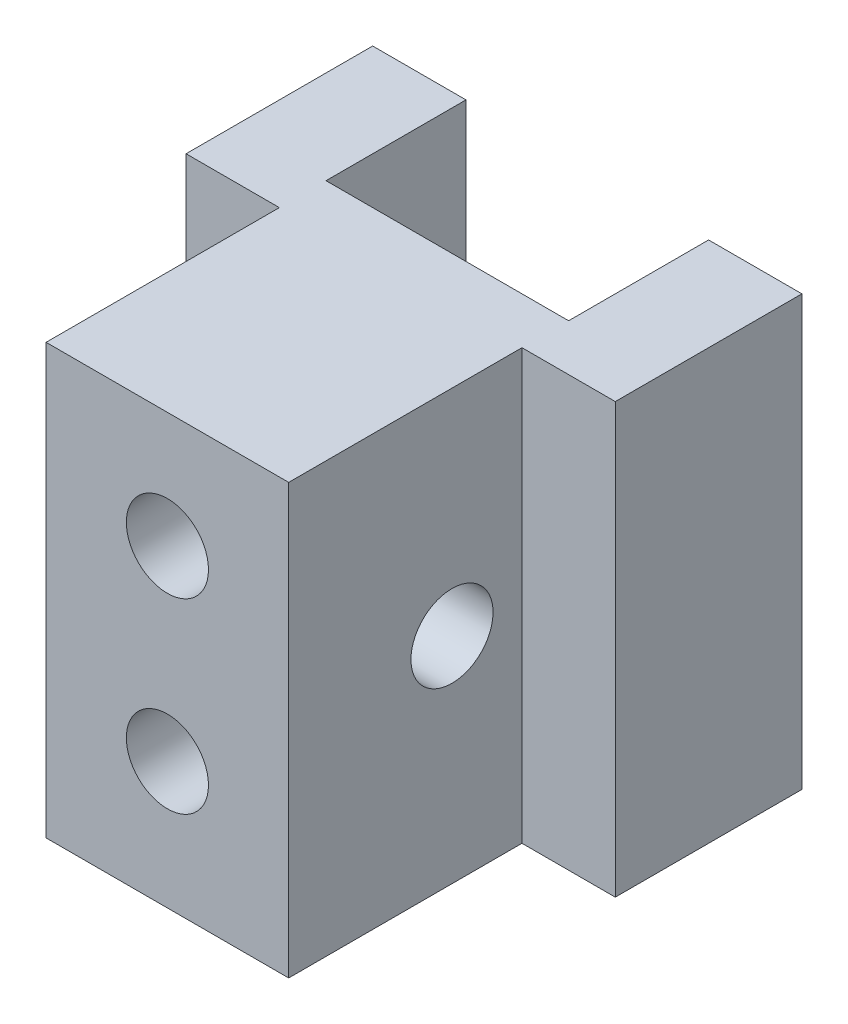
ISO-10303-21;
HEADER;
FILE_DESCRIPTION(('STEP AP214'),'2;1');
FILE_NAME('part.step','',(''),(''),'','','');
FILE_SCHEMA(('AUTOMOTIVE_DESIGN { 1 0 10303 214 1 1 1 1 }'));
ENDSEC;
DATA;
#1=APPLICATION_CONTEXT('core data for automotive mechanical design processes');
#2=APPLICATION_PROTOCOL_DEFINITION('international standard','automotive_design',2000,#1);
#3=PRODUCT_CONTEXT('',#1,'mechanical');
#4=PRODUCT('Part','Part','',(#3));
#5=PRODUCT_RELATED_PRODUCT_CATEGORY('part','',(#4));
#6=PRODUCT_DEFINITION_FORMATION('','',#4);
#7=PRODUCT_DEFINITION_CONTEXT('part definition',#1,'design');
#8=PRODUCT_DEFINITION('design','',#6,#7);
#9=PRODUCT_DEFINITION_SHAPE('','',#8);
#10=(LENGTH_UNIT() NAMED_UNIT(*) SI_UNIT(.MILLI.,.METRE.));
#11=(NAMED_UNIT(*) PLANE_ANGLE_UNIT() SI_UNIT($,.RADIAN.));
#12=(NAMED_UNIT(*) SI_UNIT($,.STERADIAN.) SOLID_ANGLE_UNIT());
#13=UNCERTAINTY_MEASURE_WITH_UNIT(LENGTH_MEASURE(1.E-05),#10,'distance_accuracy_value','');
#14=(GEOMETRIC_REPRESENTATION_CONTEXT(3) GLOBAL_UNCERTAINTY_ASSIGNED_CONTEXT((#13)) GLOBAL_UNIT_ASSIGNED_CONTEXT((#10,
#11,#12)) REPRESENTATION_CONTEXT('',''));
#15=CARTESIAN_POINT('',(0.,0.,0.));
#16=DIRECTION('',(0.,0.,1.));
#17=DIRECTION('',(1.,0.,0.));
#18=AXIS2_PLACEMENT_3D('',#15,#16,#17);
#19=CARTESIAN_POINT('',(0.,0.,0.));
#20=DIRECTION('',(0.,0.,-1.));
#21=DIRECTION('',(-1.,0.,0.));
#22=AXIS2_PLACEMENT_3D('',#19,#20,#21);
#23=PLANE('',#22);
#24=DIRECTION('',(0.,1.,0.));
#25=VECTOR('',#24,1.);
#26=CARTESIAN_POINT('',(-33.5000000000001,0.,0.));
#27=LINE('',#26,#25);
#28=CARTESIAN_POINT('',(-33.5000000000001,-151.10003589375,0.));
#29=VERTEX_POINT('',#28);
#30=CARTESIAN_POINT('',(-33.5000000000001,-128.10003589375,0.));
#31=VERTEX_POINT('',#30);
#32=EDGE_CURVE('E63',#29,#31,#27,.T.);
#33=ORIENTED_EDGE('',*,*,#32,.T.);
#34=DIRECTION('',(-1.,0.,0.));
#35=VECTOR('',#34,1.);
#36=CARTESIAN_POINT('',(-20.5000000000001,-128.10003589375,0.));
#37=LINE('',#36,#35);
#38=CARTESIAN_POINT('',(-20.5000000000001,-128.10003589375,0.));
#39=VERTEX_POINT('',#38);
#40=EDGE_CURVE('E244',#39,#31,#37,.T.);
#41=ORIENTED_EDGE('',*,*,#40,.F.);
#42=DIRECTION('',(0.,-1.,0.));
#43=VECTOR('',#42,1.);
#44=CARTESIAN_POINT('',(-20.5000000000001,0.,0.));
#45=LINE('',#44,#43);
#46=CARTESIAN_POINT('',(-20.5000000000001,-151.10003589375,0.));
#47=VERTEX_POINT('',#46);
#48=EDGE_CURVE('E191',#39,#47,#45,.T.);
#49=ORIENTED_EDGE('',*,*,#48,.T.);
#50=DIRECTION('',(1.,0.,0.));
#51=VECTOR('',#50,1.);
#52=CARTESIAN_POINT('',(-20.5000000000001,-151.10003589375,0.));
#53=LINE('',#52,#51);
#54=EDGE_CURVE('E68',#29,#47,#53,.T.);
#55=ORIENTED_EDGE('',*,*,#54,.F.);
#56=EDGE_LOOP('',(#33,#41,#49,#55));
#57=FACE_BOUND('',#56,.T.);
#58=CARTESIAN_POINT('',(-27.0000000000001,-144.30003589375,0.));
#59=DIRECTION('',(0.,0.,1.));
#60=DIRECTION('',(1.,0.,0.));
#61=AXIS2_PLACEMENT_3D('',#58,#59,#60);
#62=CIRCLE('',#61,2.20000000000001);
#63=CARTESIAN_POINT('',(-24.8000000000001,-144.30003589375,0.));
#64=VERTEX_POINT('',#63);
#65=EDGE_CURVE('E241',#64,#64,#62,.T.);
#66=ORIENTED_EDGE('',*,*,#65,.T.);
#67=EDGE_LOOP('',(#66));
#68=FACE_BOUND('',#67,.T.);
#69=CARTESIAN_POINT('',(-27.0000000000001,-134.30003589375,0.));
#70=DIRECTION('',(0.,0.,1.));
#71=DIRECTION('',(1.,0.,0.));
#72=AXIS2_PLACEMENT_3D('',#69,#70,#71);
#73=CIRCLE('',#72,2.19999999999999);
#74=CARTESIAN_POINT('',(-24.8000000000001,-134.30003589375,0.));
#75=VERTEX_POINT('',#74);
#76=EDGE_CURVE('E237',#75,#75,#73,.T.);
#77=ORIENTED_EDGE('',*,*,#76,.T.);
#78=EDGE_LOOP('',(#77));
#79=FACE_BOUND('',#78,.T.);
#80=ADVANCED_FACE('F47',(#57,#68,#79),#23,.T.);
#81=CARTESIAN_POINT('',(-20.5000000000001,-128.10003589375,10.));
#82=DIRECTION('',(-1.,0.,0.));
#83=DIRECTION('',(0.,-1.,0.));
#84=AXIS2_PLACEMENT_3D('',#81,#82,#83);
#85=PLANE('',#84);
#86=CARTESIAN_POINT('',(-20.5000000000001,-139.60003589375,6.25));
#87=DIRECTION('',(1.,0.,0.));
#88=DIRECTION('',(0.,1.,0.));
#89=AXIS2_PLACEMENT_3D('',#86,#87,#88);
#90=CIRCLE('',#89,2.2);
#91=CARTESIAN_POINT('',(-20.5000000000001,-137.40003589375,6.25));
#92=VERTEX_POINT('',#91);
#93=EDGE_CURVE('E171',#92,#92,#90,.T.);
#94=ORIENTED_EDGE('',*,*,#93,.F.);
#95=EDGE_LOOP('',(#94));
#96=FACE_BOUND('',#95,.T.);
#97=DIRECTION('',(0.,0.,-1.));
#98=VECTOR('',#97,1.);
#99=CARTESIAN_POINT('',(-20.5000000000001,-151.10003589375,10.));
#100=LINE('',#99,#98);
#101=CARTESIAN_POINT('',(-20.5000000000001,-151.10003589375,15.));
#102=VERTEX_POINT('',#101);
#103=CARTESIAN_POINT('',(-20.5000000000001,-151.10003589375,2.5));
#104=VERTEX_POINT('',#103);
#105=EDGE_CURVE('E138',#102,#104,#100,.T.);
#106=ORIENTED_EDGE('',*,*,#105,.T.);
#107=DIRECTION('',(0.,1.,0.));
#108=VECTOR('',#107,1.);
#109=CARTESIAN_POINT('',(-20.5000000000001,-151.10003589375,2.5));
#110=LINE('',#109,#108);
#111=CARTESIAN_POINT('',(-20.5000000000001,-128.10003589375,2.5));
#112=VERTEX_POINT('',#111);
#113=EDGE_CURVE('E210',#104,#112,#110,.T.);
#114=ORIENTED_EDGE('',*,*,#113,.T.);
#115=DIRECTION('',(0.,0.,-1.));
#116=VECTOR('',#115,1.);
#117=CARTESIAN_POINT('',(-20.5000000000001,-128.10003589375,10.));
#118=LINE('',#117,#116);
#119=CARTESIAN_POINT('',(-20.5000000000001,-128.10003589375,15.));
#120=VERTEX_POINT('',#119);
#121=EDGE_CURVE('E13',#120,#112,#118,.T.);
#122=ORIENTED_EDGE('',*,*,#121,.F.);
#123=DIRECTION('',(0.,1.,0.));
#124=VECTOR('',#123,1.);
#125=CARTESIAN_POINT('',(-20.5000000000001,-151.10003589375,15.));
#126=LINE('',#125,#124);
#127=EDGE_CURVE('E151',#102,#120,#126,.T.);
#128=ORIENTED_EDGE('',*,*,#127,.F.);
#129=EDGE_LOOP('',(#106,#114,#122,#128));
#130=FACE_BOUND('',#129,.T.);
#131=ADVANCED_FACE('F49',(#96,#130),#85,.F.);
#132=CARTESIAN_POINT('',(-20.5000000000001,-128.10003589375,10.));
#133=DIRECTION('',(0.,-1.,0.));
#134=DIRECTION('',(0.,0.,-1.));
#135=AXIS2_PLACEMENT_3D('',#132,#133,#134);
#136=PLANE('',#135);
#137=DIRECTION('',(0.,0.,-1.));
#138=VECTOR('',#137,1.);
#139=CARTESIAN_POINT('',(-15.5000000000001,-128.10003589375,2.5));
#140=LINE('',#139,#138);
#141=CARTESIAN_POINT('',(-15.5000000000001,-128.10003589375,2.5));
#142=VERTEX_POINT('',#141);
#143=CARTESIAN_POINT('',(-15.5000000000001,-128.10003589375,-7.5));
#144=VERTEX_POINT('',#143);
#145=EDGE_CURVE('E218',#142,#144,#140,.T.);
#146=ORIENTED_EDGE('',*,*,#145,.T.);
#147=DIRECTION('',(1.,0.,0.));
#148=VECTOR('',#147,1.);
#149=CARTESIAN_POINT('',(0.,-128.10003589375,-7.5));
#150=LINE('',#149,#148);
#151=CARTESIAN_POINT('',(-20.5000000000001,-128.10003589375,-7.5));
#152=VERTEX_POINT('',#151);
#153=EDGE_CURVE('E195',#152,#144,#150,.T.);
#154=ORIENTED_EDGE('',*,*,#153,.F.);
#155=DIRECTION('',(0.,0.,1.));
#156=VECTOR('',#155,1.);
#157=CARTESIAN_POINT('',(-20.5000000000001,-128.10003589375,-7.5));
#158=LINE('',#157,#156);
#159=EDGE_CURVE('E207',#152,#39,#158,.T.);
#160=ORIENTED_EDGE('',*,*,#159,.T.);
#161=ORIENTED_EDGE('',*,*,#40,.T.);
#162=DIRECTION('',(0.,0.,1.));
#163=VECTOR('',#162,1.);
#164=CARTESIAN_POINT('',(-33.5000000000001,-128.10003589375,-7.5));
#165=LINE('',#164,#163);
#166=CARTESIAN_POINT('',(-33.5000000000001,-128.10003589375,-7.5));
#167=VERTEX_POINT('',#166);
#168=EDGE_CURVE('E185',#167,#31,#165,.T.);
#169=ORIENTED_EDGE('',*,*,#168,.F.);
#170=DIRECTION('',(1.,0.,0.));
#171=VECTOR('',#170,1.);
#172=CARTESIAN_POINT('',(0.,-128.10003589375,-7.5));
#173=LINE('',#172,#171);
#174=CARTESIAN_POINT('',(-38.5000000000001,-128.10003589375,-7.5));
#175=VERTEX_POINT('',#174);
#176=EDGE_CURVE('E183',#175,#167,#173,.T.);
#177=ORIENTED_EDGE('',*,*,#176,.F.);
#178=DIRECTION('',(0.,0.,-1.));
#179=VECTOR('',#178,1.);
#180=CARTESIAN_POINT('',(-38.5000000000001,-128.10003589375,2.5));
#181=LINE('',#180,#179);
#182=CARTESIAN_POINT('',(-38.5000000000001,-128.10003589375,2.5));
#183=VERTEX_POINT('',#182);
#184=EDGE_CURVE('E235',#183,#175,#181,.T.);
#185=ORIENTED_EDGE('',*,*,#184,.F.);
#186=DIRECTION('',(1.,0.,0.));
#187=VECTOR('',#186,1.);
#188=CARTESIAN_POINT('',(-38.5000000000001,-128.10003589375,2.5));
#189=LINE('',#188,#187);
#190=CARTESIAN_POINT('',(-33.5000000000001,-128.10003589375,2.5));
#191=VERTEX_POINT('',#190);
#192=EDGE_CURVE('E221',#183,#191,#189,.T.);
#193=ORIENTED_EDGE('',*,*,#192,.T.);
#194=DIRECTION('',(0.,0.,-1.));
#195=VECTOR('',#194,1.);
#196=CARTESIAN_POINT('',(-33.5000000000001,-128.10003589375,10.));
#197=LINE('',#196,#195);
#198=CARTESIAN_POINT('',(-33.5000000000001,-128.10003589375,15.));
#199=VERTEX_POINT('',#198);
#200=EDGE_CURVE('E56',#199,#191,#197,.T.);
#201=ORIENTED_EDGE('',*,*,#200,.F.);
#202=DIRECTION('',(-1.,0.,0.));
#203=VECTOR('',#202,1.);
#204=CARTESIAN_POINT('',(-20.5000000000001,-128.10003589375,15.));
#205=LINE('',#204,#203);
#206=EDGE_CURVE('E155',#120,#199,#205,.T.);
#207=ORIENTED_EDGE('',*,*,#206,.F.);
#208=ORIENTED_EDGE('',*,*,#121,.T.);
#209=DIRECTION('',(1.,0.,0.));
#210=VECTOR('',#209,1.);
#211=CARTESIAN_POINT('',(-20.5000000000001,-128.10003589375,2.5));
#212=LINE('',#211,#210);
#213=EDGE_CURVE('E212',#112,#142,#212,.T.);
#214=ORIENTED_EDGE('',*,*,#213,.T.);
#215=EDGE_LOOP('',(#146,#154,#160,#161,#169,#177,#185,#193,#201,#207,#208,#214));
#216=FACE_BOUND('',#215,.T.);
#217=ADVANCED_FACE('F252',(#216),#136,.F.);
#218=CARTESIAN_POINT('',(-33.5000000000001,-128.10003589375,10.));
#219=DIRECTION('',(1.,0.,0.));
#220=DIRECTION('',(0.,0.,-1.));
#221=AXIS2_PLACEMENT_3D('',#218,#219,#220);
#222=PLANE('',#221);
#223=CARTESIAN_POINT('',(-33.5000000000001,-139.60003589375,6.25));
#224=DIRECTION('',(1.,0.,0.));
#225=DIRECTION('',(0.,0.,-1.));
#226=AXIS2_PLACEMENT_3D('',#223,#224,#225);
#227=CIRCLE('',#226,2.2);
#228=CARTESIAN_POINT('',(-33.5000000000001,-139.60003589375,4.05));
#229=VERTEX_POINT('',#228);
#230=EDGE_CURVE('E51',#229,#229,#227,.T.);
#231=ORIENTED_EDGE('',*,*,#230,.T.);
#232=EDGE_LOOP('',(#231));
#233=FACE_BOUND('',#232,.T.);
#234=ORIENTED_EDGE('',*,*,#200,.T.);
#235=DIRECTION('',(0.,-1.,0.));
#236=VECTOR('',#235,1.);
#237=CARTESIAN_POINT('',(-33.5000000000001,-128.10003589375,2.5));
#238=LINE('',#237,#236);
#239=CARTESIAN_POINT('',(-33.5000000000001,-151.10003589375,2.5));
#240=VERTEX_POINT('',#239);
#241=EDGE_CURVE('E225',#191,#240,#238,.T.);
#242=ORIENTED_EDGE('',*,*,#241,.T.);
#243=DIRECTION('',(0.,0.,-1.));
#244=VECTOR('',#243,1.);
#245=CARTESIAN_POINT('',(-33.5000000000001,-151.10003589375,10.));
#246=LINE('',#245,#244);
#247=CARTESIAN_POINT('',(-33.5000000000001,-151.10003589375,15.));
#248=VERTEX_POINT('',#247);
#249=EDGE_CURVE('E148',#248,#240,#246,.T.);
#250=ORIENTED_EDGE('',*,*,#249,.F.);
#251=DIRECTION('',(0.,-1.,0.));
#252=VECTOR('',#251,1.);
#253=CARTESIAN_POINT('',(-33.5000000000001,-128.10003589375,15.));
#254=LINE('',#253,#252);
#255=EDGE_CURVE('E161',#199,#248,#254,.T.);
#256=ORIENTED_EDGE('',*,*,#255,.F.);
#257=EDGE_LOOP('',(#234,#242,#250,#256));
#258=FACE_BOUND('',#257,.T.);
#259=ADVANCED_FACE('F250',(#233,#258),#222,.F.);
#260=CARTESIAN_POINT('',(-20.5000000000001,-151.10003589375,10.));
#261=DIRECTION('',(0.,1.,0.));
#262=DIRECTION('',(0.,0.,1.));
#263=AXIS2_PLACEMENT_3D('',#260,#261,#262);
#264=PLANE('',#263);
#265=DIRECTION('',(0.,0.,-1.));
#266=VECTOR('',#265,1.);
#267=CARTESIAN_POINT('',(-38.5000000000001,-151.10003589375,2.5));
#268=LINE('',#267,#266);
#269=CARTESIAN_POINT('',(-38.5000000000001,-151.10003589375,2.5));
#270=VERTEX_POINT('',#269);
#271=CARTESIAN_POINT('',(-38.5000000000001,-151.10003589375,-7.5));
#272=VERTEX_POINT('',#271);
#273=EDGE_CURVE('E234',#270,#272,#268,.T.);
#274=ORIENTED_EDGE('',*,*,#273,.T.);
#275=DIRECTION('',(-1.,0.,0.));
#276=VECTOR('',#275,1.);
#277=CARTESIAN_POINT('',(0.,-151.10003589375,-7.5));
#278=LINE('',#277,#276);
#279=CARTESIAN_POINT('',(-33.5000000000001,-151.10003589375,-7.5));
#280=VERTEX_POINT('',#279);
#281=EDGE_CURVE('E177',#280,#272,#278,.T.);
#282=ORIENTED_EDGE('',*,*,#281,.F.);
#283=DIRECTION('',(0.,0.,1.));
#284=VECTOR('',#283,1.);
#285=CARTESIAN_POINT('',(-33.5000000000001,-151.10003589375,-7.5));
#286=LINE('',#285,#284);
#287=EDGE_CURVE('E189',#280,#29,#286,.T.);
#288=ORIENTED_EDGE('',*,*,#287,.T.);
#289=ORIENTED_EDGE('',*,*,#54,.T.);
#290=DIRECTION('',(0.,0.,1.));
#291=VECTOR('',#290,1.);
#292=CARTESIAN_POINT('',(-20.5000000000001,-151.10003589375,-7.5));
#293=LINE('',#292,#291);
#294=CARTESIAN_POINT('',(-20.5000000000001,-151.10003589375,-7.5));
#295=VERTEX_POINT('',#294);
#296=EDGE_CURVE('E203',#295,#47,#293,.T.);
#297=ORIENTED_EDGE('',*,*,#296,.F.);
#298=DIRECTION('',(-1.,0.,0.));
#299=VECTOR('',#298,1.);
#300=CARTESIAN_POINT('',(0.,-151.10003589375,-7.5));
#301=LINE('',#300,#299);
#302=CARTESIAN_POINT('',(-15.5000000000001,-151.10003589375,-7.5));
#303=VERTEX_POINT('',#302);
#304=EDGE_CURVE('E201',#303,#295,#301,.T.);
#305=ORIENTED_EDGE('',*,*,#304,.F.);
#306=DIRECTION('',(0.,0.,-1.));
#307=VECTOR('',#306,1.);
#308=CARTESIAN_POINT('',(-15.5000000000001,-151.10003589375,2.5));
#309=LINE('',#308,#307);
#310=CARTESIAN_POINT('',(-15.5000000000001,-151.10003589375,2.5));
#311=VERTEX_POINT('',#310);
#312=EDGE_CURVE('E219',#311,#303,#309,.T.);
#313=ORIENTED_EDGE('',*,*,#312,.F.);
#314=DIRECTION('',(-1.,0.,0.));
#315=VECTOR('',#314,1.);
#316=CARTESIAN_POINT('',(-15.5000000000001,-151.10003589375,2.5));
#317=LINE('',#316,#315);
#318=EDGE_CURVE('E145',#311,#104,#317,.T.);
#319=ORIENTED_EDGE('',*,*,#318,.T.);
#320=ORIENTED_EDGE('',*,*,#105,.F.);
#321=DIRECTION('',(1.,0.,0.));
#322=VECTOR('',#321,1.);
#323=CARTESIAN_POINT('',(-33.5000000000001,-151.10003589375,15.));
#324=LINE('',#323,#322);
#325=EDGE_CURVE('E143',#248,#102,#324,.T.);
#326=ORIENTED_EDGE('',*,*,#325,.F.);
#327=ORIENTED_EDGE('',*,*,#249,.T.);
#328=DIRECTION('',(-1.,0.,0.));
#329=VECTOR('',#328,1.);
#330=CARTESIAN_POINT('',(-33.5000000000001,-151.10003589375,2.5));
#331=LINE('',#330,#329);
#332=EDGE_CURVE('E228',#240,#270,#331,.T.);
#333=ORIENTED_EDGE('',*,*,#332,.T.);
#334=EDGE_LOOP('',(#274,#282,#288,#289,#297,#305,#313,#319,#320,#326,#327,#333));
#335=FACE_BOUND('',#334,.T.);
#336=ADVANCED_FACE('F140',(#335),#264,.F.);
#337=CARTESIAN_POINT('',(-27.0000000000001,-144.30003589375,10.));
#338=DIRECTION('',(0.,0.,-1.));
#339=DIRECTION('',(-1.,0.,0.));
#340=AXIS2_PLACEMENT_3D('',#337,#338,#339);
#341=CYLINDRICAL_SURFACE('',#340,2.20000000000001);
#342=ORIENTED_EDGE('',*,*,#65,.F.);
#343=EDGE_LOOP('',(#342));
#344=FACE_BOUND('',#343,.T.);
#345=CARTESIAN_POINT('',(-27.0000000000001,-144.30003589375,15.));
#346=DIRECTION('',(0.,0.,1.));
#347=DIRECTION('',(1.,0.,0.));
#348=AXIS2_PLACEMENT_3D('',#345,#346,#347);
#349=CIRCLE('',#348,2.20000000000001);
#350=CARTESIAN_POINT('',(-24.8000000000001,-144.30003589375,15.));
#351=VERTEX_POINT('',#350);
#352=EDGE_CURVE('E165',#351,#351,#349,.T.);
#353=ORIENTED_EDGE('',*,*,#352,.T.);
#354=EDGE_LOOP('',(#353));
#355=FACE_BOUND('',#354,.T.);
#356=ADVANCED_FACE('F300',(#344,#355),#341,.F.);
#357=CARTESIAN_POINT('',(-27.0000000000001,-134.30003589375,10.));
#358=DIRECTION('',(0.,0.,-1.));
#359=DIRECTION('',(-1.,0.,0.));
#360=AXIS2_PLACEMENT_3D('',#357,#358,#359);
#361=CYLINDRICAL_SURFACE('',#360,2.19999999999999);
#362=ORIENTED_EDGE('',*,*,#76,.F.);
#363=EDGE_LOOP('',(#362));
#364=FACE_BOUND('',#363,.T.);
#365=CARTESIAN_POINT('',(-27.0000000000001,-134.30003589375,15.));
#366=DIRECTION('',(0.,0.,1.));
#367=DIRECTION('',(1.,0.,0.));
#368=AXIS2_PLACEMENT_3D('',#365,#366,#367);
#369=CIRCLE('',#368,2.19999999999999);
#370=CARTESIAN_POINT('',(-24.8000000000001,-134.30003589375,15.));
#371=VERTEX_POINT('',#370);
#372=EDGE_CURVE('E162',#371,#371,#369,.T.);
#373=ORIENTED_EDGE('',*,*,#372,.T.);
#374=EDGE_LOOP('',(#373));
#375=FACE_BOUND('',#374,.T.);
#376=ADVANCED_FACE('F325',(#364,#375),#361,.F.);
#377=CARTESIAN_POINT('',(-38.5000000000001,-128.10003589375,2.5));
#378=DIRECTION('',(-1.,0.,0.));
#379=DIRECTION('',(0.,0.,1.));
#380=AXIS2_PLACEMENT_3D('',#377,#378,#379);
#381=PLANE('',#380);
#382=ORIENTED_EDGE('',*,*,#184,.T.);
#383=DIRECTION('',(0.,1.,0.));
#384=VECTOR('',#383,1.);
#385=CARTESIAN_POINT('',(-38.5000000000001,0.,-7.5));
#386=LINE('',#385,#384);
#387=EDGE_CURVE('E180',#272,#175,#386,.T.);
#388=ORIENTED_EDGE('',*,*,#387,.F.);
#389=ORIENTED_EDGE('',*,*,#273,.F.);
#390=DIRECTION('',(0.,1.,0.));
#391=VECTOR('',#390,1.);
#392=CARTESIAN_POINT('',(-38.5000000000001,-128.10003589375,2.5));
#393=LINE('',#392,#391);
#394=EDGE_CURVE('E231',#270,#183,#393,.T.);
#395=ORIENTED_EDGE('',*,*,#394,.T.);
#396=EDGE_LOOP('',(#382,#388,#389,#395));
#397=FACE_BOUND('',#396,.T.);
#398=ADVANCED_FACE('F259',(#397),#381,.T.);
#399=CARTESIAN_POINT('',(0.,0.,2.5));
#400=DIRECTION('',(0.,0.,-1.));
#401=DIRECTION('',(-1.,0.,0.));
#402=AXIS2_PLACEMENT_3D('',#399,#400,#401);
#403=PLANE('',#402);
#404=ORIENTED_EDGE('',*,*,#192,.F.);
#405=ORIENTED_EDGE('',*,*,#394,.F.);
#406=ORIENTED_EDGE('',*,*,#332,.F.);
#407=ORIENTED_EDGE('',*,*,#241,.F.);
#408=EDGE_LOOP('',(#404,#405,#406,#407));
#409=FACE_BOUND('',#408,.T.);
#410=ADVANCED_FACE('F257',(#409),#403,.F.);
#411=CARTESIAN_POINT('',(-15.5000000000001,-151.10003589375,2.5));
#412=DIRECTION('',(1.,0.,0.));
#413=DIRECTION('',(0.,1.,0.));
#414=AXIS2_PLACEMENT_3D('',#411,#412,#413);
#415=PLANE('',#414);
#416=ORIENTED_EDGE('',*,*,#312,.T.);
#417=DIRECTION('',(0.,-1.,0.));
#418=VECTOR('',#417,1.);
#419=CARTESIAN_POINT('',(-15.5000000000001,0.,-7.5));
#420=LINE('',#419,#418);
#421=EDGE_CURVE('E198',#144,#303,#420,.T.);
#422=ORIENTED_EDGE('',*,*,#421,.F.);
#423=ORIENTED_EDGE('',*,*,#145,.F.);
#424=DIRECTION('',(0.,-1.,0.));
#425=VECTOR('',#424,1.);
#426=CARTESIAN_POINT('',(-15.5000000000001,-151.10003589375,2.5));
#427=LINE('',#426,#425);
#428=EDGE_CURVE('E215',#142,#311,#427,.T.);
#429=ORIENTED_EDGE('',*,*,#428,.T.);
#430=EDGE_LOOP('',(#416,#422,#423,#429));
#431=FACE_BOUND('',#430,.T.);
#432=ADVANCED_FACE('F283',(#431),#415,.T.);
#433=CARTESIAN_POINT('',(0.,0.,2.5));
#434=DIRECTION('',(0.,0.,-1.));
#435=DIRECTION('',(-1.,0.,0.));
#436=AXIS2_PLACEMENT_3D('',#433,#434,#435);
#437=PLANE('',#436);
#438=ORIENTED_EDGE('',*,*,#318,.F.);
#439=ORIENTED_EDGE('',*,*,#428,.F.);
#440=ORIENTED_EDGE('',*,*,#213,.F.);
#441=ORIENTED_EDGE('',*,*,#113,.F.);
#442=EDGE_LOOP('',(#438,#439,#440,#441));
#443=FACE_BOUND('',#442,.T.);
#444=ADVANCED_FACE('F282',(#443),#437,.F.);
#445=CARTESIAN_POINT('',(-20.5000000000001,0.,-7.5));
#446=DIRECTION('',(-1.,0.,0.));
#447=DIRECTION('',(0.,0.,1.));
#448=AXIS2_PLACEMENT_3D('',#445,#446,#447);
#449=PLANE('',#448);
#450=ORIENTED_EDGE('',*,*,#48,.F.);
#451=ORIENTED_EDGE('',*,*,#159,.F.);
#452=DIRECTION('',(0.,-1.,0.));
#453=VECTOR('',#452,1.);
#454=CARTESIAN_POINT('',(-20.5000000000001,0.,-7.5));
#455=LINE('',#454,#453);
#456=EDGE_CURVE('E192',#152,#295,#455,.T.);
#457=ORIENTED_EDGE('',*,*,#456,.T.);
#458=ORIENTED_EDGE('',*,*,#296,.T.);
#459=EDGE_LOOP('',(#450,#451,#457,#458));
#460=FACE_BOUND('',#459,.T.);
#461=ADVANCED_FACE('F272',(#460),#449,.T.);
#462=CARTESIAN_POINT('',(0.,0.,-7.5));
#463=DIRECTION('',(0.,0.,-1.));
#464=DIRECTION('',(-1.,0.,0.));
#465=AXIS2_PLACEMENT_3D('',#462,#463,#464);
#466=PLANE('',#465);
#467=ORIENTED_EDGE('',*,*,#456,.F.);
#468=ORIENTED_EDGE('',*,*,#153,.T.);
#469=ORIENTED_EDGE('',*,*,#421,.T.);
#470=ORIENTED_EDGE('',*,*,#304,.T.);
#471=EDGE_LOOP('',(#467,#468,#469,#470));
#472=FACE_BOUND('',#471,.T.);
#473=ADVANCED_FACE('F278',(#472),#466,.T.);
#474=CARTESIAN_POINT('',(-33.5000000000001,0.,-7.5));
#475=DIRECTION('',(1.,0.,0.));
#476=DIRECTION('',(0.,0.,-1.));
#477=AXIS2_PLACEMENT_3D('',#474,#475,#476);
#478=PLANE('',#477);
#479=ORIENTED_EDGE('',*,*,#32,.F.);
#480=ORIENTED_EDGE('',*,*,#287,.F.);
#481=DIRECTION('',(0.,1.,0.));
#482=VECTOR('',#481,1.);
#483=CARTESIAN_POINT('',(-33.5000000000001,0.,-7.5));
#484=LINE('',#483,#482);
#485=EDGE_CURVE('E174',#280,#167,#484,.T.);
#486=ORIENTED_EDGE('',*,*,#485,.T.);
#487=ORIENTED_EDGE('',*,*,#168,.T.);
#488=EDGE_LOOP('',(#479,#480,#486,#487));
#489=FACE_BOUND('',#488,.T.);
#490=ADVANCED_FACE('F267',(#489),#478,.T.);
#491=CARTESIAN_POINT('',(0.,0.,-7.5));
#492=DIRECTION('',(0.,0.,-1.));
#493=DIRECTION('',(-1.,0.,0.));
#494=AXIS2_PLACEMENT_3D('',#491,#492,#493);
#495=PLANE('',#494);
#496=ORIENTED_EDGE('',*,*,#485,.F.);
#497=ORIENTED_EDGE('',*,*,#281,.T.);
#498=ORIENTED_EDGE('',*,*,#387,.T.);
#499=ORIENTED_EDGE('',*,*,#176,.T.);
#500=EDGE_LOOP('',(#496,#497,#498,#499));
#501=FACE_BOUND('',#500,.T.);
#502=ADVANCED_FACE('F264',(#501),#495,.T.);
#503=CARTESIAN_POINT('',(-38.5000000000001,-139.60003589375,6.25));
#504=DIRECTION('',(1.,0.,0.));
#505=DIRECTION('',(0.,1.,0.));
#506=AXIS2_PLACEMENT_3D('',#503,#504,#505);
#507=CYLINDRICAL_SURFACE('',#506,2.2);
#508=ORIENTED_EDGE('',*,*,#93,.T.);
#509=EDGE_LOOP('',(#508));
#510=FACE_BOUND('',#509,.T.);
#511=ORIENTED_EDGE('',*,*,#230,.F.);
#512=EDGE_LOOP('',(#511));
#513=FACE_BOUND('',#512,.T.);
#514=ADVANCED_FACE('F443',(#510,#513),#507,.F.);
#515=CARTESIAN_POINT('',(0.,0.,15.));
#516=DIRECTION('',(0.,0.,1.));
#517=DIRECTION('',(1.,0.,0.));
#518=AXIS2_PLACEMENT_3D('',#515,#516,#517);
#519=PLANE('',#518);
#520=ORIENTED_EDGE('',*,*,#372,.F.);
#521=EDGE_LOOP('',(#520));
#522=FACE_BOUND('',#521,.T.);
#523=ORIENTED_EDGE('',*,*,#325,.T.);
#524=ORIENTED_EDGE('',*,*,#127,.T.);
#525=ORIENTED_EDGE('',*,*,#206,.T.);
#526=ORIENTED_EDGE('',*,*,#255,.T.);
#527=EDGE_LOOP('',(#523,#524,#525,#526));
#528=FACE_BOUND('',#527,.T.);
#529=ORIENTED_EDGE('',*,*,#352,.F.);
#530=EDGE_LOOP('',(#529));
#531=FACE_BOUND('',#530,.T.);
#532=ADVANCED_FACE('F158',(#522,#528,#531),#519,.T.);
#533=CLOSED_SHELL('',(#80,#131,#217,#259,#336,#356,#376,#398,#410,#432,#444,#461,#473,#490,#502,
#514,#532));
#534=MANIFOLD_SOLID_BREP('B2',#533);
#535=ADVANCED_BREP_SHAPE_REPRESENTATION('',(#18,#534),#14);
#536=SHAPE_DEFINITION_REPRESENTATION(#9,#535);
ENDSEC;
END-ISO-10303-21;
